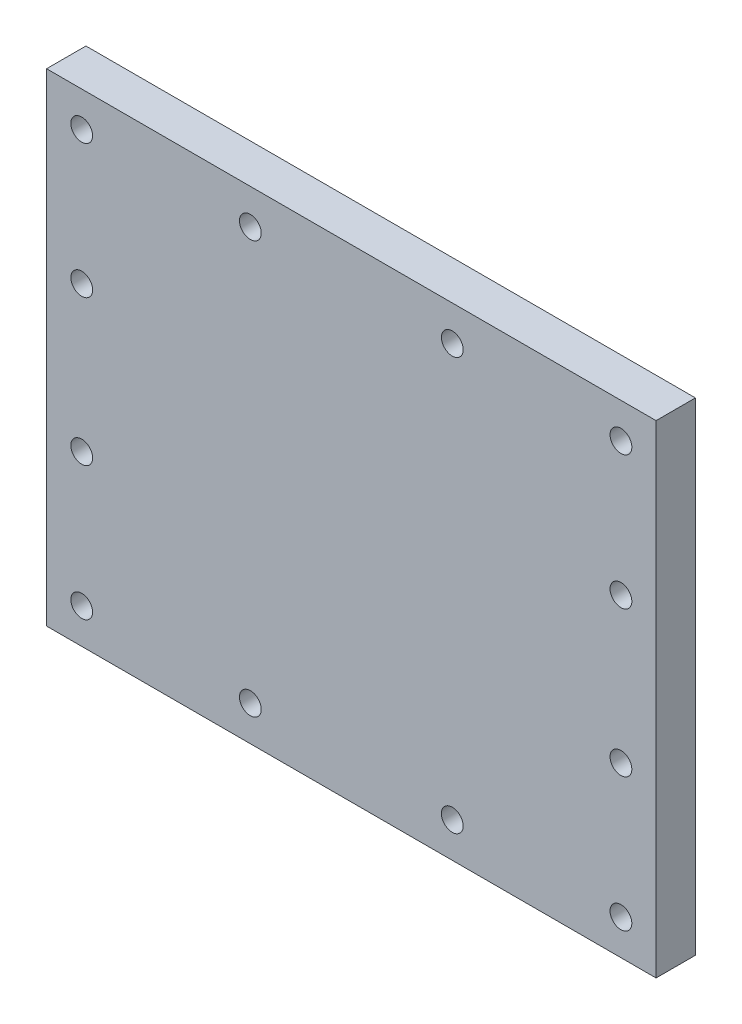
ISO-10303-21;
HEADER;
FILE_DESCRIPTION(('STEP AP214'),'2;1');
FILE_NAME('part.step','',(''),(''),'','','');
FILE_SCHEMA(('AUTOMOTIVE_DESIGN { 1 0 10303 214 1 1 1 1 }'));
ENDSEC;
DATA;
#1=APPLICATION_CONTEXT('core data for automotive mechanical design processes');
#2=APPLICATION_PROTOCOL_DEFINITION('international standard','automotive_design',2000,#1);
#3=PRODUCT_CONTEXT('',#1,'mechanical');
#4=PRODUCT('Part','Part','',(#3));
#5=PRODUCT_RELATED_PRODUCT_CATEGORY('part','',(#4));
#6=PRODUCT_DEFINITION_FORMATION('','',#4);
#7=PRODUCT_DEFINITION_CONTEXT('part definition',#1,'design');
#8=PRODUCT_DEFINITION('design','',#6,#7);
#9=PRODUCT_DEFINITION_SHAPE('','',#8);
#10=(LENGTH_UNIT() NAMED_UNIT(*) SI_UNIT(.MILLI.,.METRE.));
#11=(NAMED_UNIT(*) PLANE_ANGLE_UNIT() SI_UNIT($,.RADIAN.));
#12=(NAMED_UNIT(*) SI_UNIT($,.STERADIAN.) SOLID_ANGLE_UNIT());
#13=UNCERTAINTY_MEASURE_WITH_UNIT(LENGTH_MEASURE(1.E-05),#10,'distance_accuracy_value','');
#14=(GEOMETRIC_REPRESENTATION_CONTEXT(3) GLOBAL_UNCERTAINTY_ASSIGNED_CONTEXT((#13)) GLOBAL_UNIT_ASSIGNED_CONTEXT((#10,
#11,#12)) REPRESENTATION_CONTEXT('',''));
#15=CARTESIAN_POINT('',(0.,0.,0.));
#16=DIRECTION('',(0.,0.,1.));
#17=DIRECTION('',(1.,0.,0.));
#18=AXIS2_PLACEMENT_3D('',#15,#16,#17);
#19=CARTESIAN_POINT('',(-58.5243128246472,36.6443544247679,-5.51040500289528));
#20=DIRECTION('',(1.,0.,0.));
#21=DIRECTION('',(0.,1.,0.));
#22=AXIS2_PLACEMENT_3D('',#19,#20,#21);
#23=PLANE('',#22);
#24=DIRECTION('',(0.,-1.,0.));
#25=VECTOR('',#24,1.);
#26=CARTESIAN_POINT('',(-58.5243128246472,36.6443544247679,-11.1104050028953));
#27=LINE('',#26,#25);
#28=CARTESIAN_POINT('',(-58.5243128246472,105.341954424767,-11.1104050028953));
#29=VERTEX_POINT('',#28);
#30=CARTESIAN_POINT('',(-58.5243128246472,36.6443544247679,-11.1104050028953));
#31=VERTEX_POINT('',#30);
#32=EDGE_CURVE('E100',#29,#31,#27,.T.);
#33=ORIENTED_EDGE('',*,*,#32,.F.);
#34=DIRECTION('',(0.,0.,-1.));
#35=VECTOR('',#34,1.);
#36=CARTESIAN_POINT('',(-58.5243128246472,105.341954424767,-5.51040500289528));
#37=LINE('',#36,#35);
#38=CARTESIAN_POINT('',(-58.5243128246472,105.341954424767,-5.51040500289528));
#39=VERTEX_POINT('',#38);
#40=EDGE_CURVE('E11',#39,#29,#37,.T.);
#41=ORIENTED_EDGE('',*,*,#40,.F.);
#42=DIRECTION('',(0.,-1.,0.));
#43=VECTOR('',#42,1.);
#44=CARTESIAN_POINT('',(-58.5243128246472,36.6443544247679,-5.51040500289528));
#45=LINE('',#44,#43);
#46=CARTESIAN_POINT('',(-58.5243128246472,36.6443544247679,-5.51040500289528));
#47=VERTEX_POINT('',#46);
#48=EDGE_CURVE('E93',#39,#47,#45,.T.);
#49=ORIENTED_EDGE('',*,*,#48,.T.);
#50=DIRECTION('',(0.,0.,-1.));
#51=VECTOR('',#50,1.);
#52=CARTESIAN_POINT('',(-58.5243128246472,36.6443544247679,-5.51040500289528));
#53=LINE('',#52,#51);
#54=EDGE_CURVE('E38',#47,#31,#53,.T.);
#55=ORIENTED_EDGE('',*,*,#54,.T.);
#56=EDGE_LOOP('',(#33,#41,#49,#55));
#57=FACE_BOUND('',#56,.T.);
#58=ADVANCED_FACE('F35',(#57),#23,.T.);
#59=CARTESIAN_POINT('',(-58.5243128246472,105.341954424767,-5.51040500289528));
#60=DIRECTION('',(0.,1.,0.));
#61=DIRECTION('',(-1.,0.,0.));
#62=AXIS2_PLACEMENT_3D('',#59,#60,#61);
#63=PLANE('',#62);
#64=DIRECTION('',(1.,0.,0.));
#65=VECTOR('',#64,1.);
#66=CARTESIAN_POINT('',(-58.5243128246472,105.341954424767,-11.1104050028953));
#67=LINE('',#66,#65);
#68=CARTESIAN_POINT('',(-145.264312824647,105.341954424767,-11.1104050028953));
#69=VERTEX_POINT('',#68);
#70=EDGE_CURVE('E95',#69,#29,#67,.T.);
#71=ORIENTED_EDGE('',*,*,#70,.F.);
#72=DIRECTION('',(0.,0.,-1.));
#73=VECTOR('',#72,1.);
#74=CARTESIAN_POINT('',(-145.264312824647,105.341954424767,-5.51040500289528));
#75=LINE('',#74,#73);
#76=CARTESIAN_POINT('',(-145.264312824647,105.341954424767,-5.51040500289528));
#77=VERTEX_POINT('',#76);
#78=EDGE_CURVE('E44',#77,#69,#75,.T.);
#79=ORIENTED_EDGE('',*,*,#78,.F.);
#80=DIRECTION('',(1.,0.,0.));
#81=VECTOR('',#80,1.);
#82=CARTESIAN_POINT('',(-58.5243128246472,105.341954424767,-5.51040500289528));
#83=LINE('',#82,#81);
#84=EDGE_CURVE('E90',#77,#39,#83,.T.);
#85=ORIENTED_EDGE('',*,*,#84,.T.);
#86=ORIENTED_EDGE('',*,*,#40,.T.);
#87=EDGE_LOOP('',(#71,#79,#85,#86));
#88=FACE_BOUND('',#87,.T.);
#89=ADVANCED_FACE('F111',(#88),#63,.T.);
#90=CARTESIAN_POINT('',(-145.264312824647,36.6443544247679,-5.51040500289528));
#91=DIRECTION('',(-1.,0.,0.));
#92=DIRECTION('',(0.,0.,1.));
#93=AXIS2_PLACEMENT_3D('',#90,#91,#92);
#94=PLANE('',#93);
#95=DIRECTION('',(0.,1.,0.));
#96=VECTOR('',#95,1.);
#97=CARTESIAN_POINT('',(-145.264312824647,36.6443544247679,-11.1104050028953));
#98=LINE('',#97,#96);
#99=CARTESIAN_POINT('',(-145.264312824647,36.6443544247679,-11.1104050028953));
#100=VERTEX_POINT('',#99);
#101=EDGE_CURVE('E85',#100,#69,#98,.T.);
#102=ORIENTED_EDGE('',*,*,#101,.F.);
#103=DIRECTION('',(0.,0.,-1.));
#104=VECTOR('',#103,1.);
#105=CARTESIAN_POINT('',(-145.264312824647,36.6443544247679,-5.51040500289528));
#106=LINE('',#105,#104);
#107=CARTESIAN_POINT('',(-145.264312824647,36.6443544247679,-5.51040500289528));
#108=VERTEX_POINT('',#107);
#109=EDGE_CURVE('E80',#108,#100,#106,.T.);
#110=ORIENTED_EDGE('',*,*,#109,.F.);
#111=DIRECTION('',(0.,1.,0.));
#112=VECTOR('',#111,1.);
#113=CARTESIAN_POINT('',(-145.264312824647,36.6443544247679,-5.51040500289528));
#114=LINE('',#113,#112);
#115=EDGE_CURVE('E83',#108,#77,#114,.T.);
#116=ORIENTED_EDGE('',*,*,#115,.T.);
#117=ORIENTED_EDGE('',*,*,#78,.T.);
#118=EDGE_LOOP('',(#102,#110,#116,#117));
#119=FACE_BOUND('',#118,.T.);
#120=ADVANCED_FACE('F82',(#119),#94,.T.);
#121=CARTESIAN_POINT('',(-58.5243128246472,36.6443544247679,-5.51040500289528));
#122=DIRECTION('',(0.,-1.,0.));
#123=DIRECTION('',(1.,0.,0.));
#124=AXIS2_PLACEMENT_3D('',#121,#122,#123);
#125=PLANE('',#124);
#126=DIRECTION('',(-1.,0.,0.));
#127=VECTOR('',#126,1.);
#128=CARTESIAN_POINT('',(-58.5243128246472,36.6443544247679,-11.1104050028953));
#129=LINE('',#128,#127);
#130=EDGE_CURVE('E103',#31,#100,#129,.T.);
#131=ORIENTED_EDGE('',*,*,#130,.F.);
#132=ORIENTED_EDGE('',*,*,#54,.F.);
#133=DIRECTION('',(-1.,0.,0.));
#134=VECTOR('',#133,1.);
#135=CARTESIAN_POINT('',(-58.5243128246472,36.6443544247679,-5.51040500289528));
#136=LINE('',#135,#134);
#137=EDGE_CURVE('E89',#47,#108,#136,.T.);
#138=ORIENTED_EDGE('',*,*,#137,.T.);
#139=ORIENTED_EDGE('',*,*,#109,.T.);
#140=EDGE_LOOP('',(#131,#132,#138,#139));
#141=FACE_BOUND('',#140,.T.);
#142=ADVANCED_FACE('F92',(#141),#125,.T.);
#143=CARTESIAN_POINT('',(0.,0.,-5.51040500289528));
#144=DIRECTION('',(0.,0.,1.));
#145=DIRECTION('',(1.,0.,0.));
#146=AXIS2_PLACEMENT_3D('',#143,#144,#145);
#147=PLANE('',#146);
#148=CARTESIAN_POINT('',(-63.5243128246471,60.6443544247679,-5.51040500289528));
#149=DIRECTION('',(0.,0.,-1.));
#150=DIRECTION('',(-1.,0.,0.));
#151=AXIS2_PLACEMENT_3D('',#148,#149,#150);
#152=CIRCLE('',#151,1.54999999999999);
#153=CARTESIAN_POINT('',(-65.0743128246471,60.6443544247679,-5.51040500289528));
#154=VERTEX_POINT('',#153);
#155=EDGE_CURVE('E184',#154,#154,#152,.T.);
#156=ORIENTED_EDGE('',*,*,#155,.T.);
#157=EDGE_LOOP('',(#156));
#158=FACE_BOUND('',#157,.T.);
#159=CARTESIAN_POINT('',(-87.5243128246472,41.6443544247679,-5.51040500289528));
#160=DIRECTION('',(0.,0.,-1.));
#161=DIRECTION('',(-1.,0.,0.));
#162=AXIS2_PLACEMENT_3D('',#159,#160,#161);
#163=CIRCLE('',#162,1.54999999999999);
#164=CARTESIAN_POINT('',(-89.0743128246472,41.6443544247679,-5.51040500289528));
#165=VERTEX_POINT('',#164);
#166=EDGE_CURVE('E192',#165,#165,#163,.T.);
#167=ORIENTED_EDGE('',*,*,#166,.T.);
#168=EDGE_LOOP('',(#167));
#169=FACE_BOUND('',#168,.T.);
#170=CARTESIAN_POINT('',(-63.5243128246472,41.6443544247679,-5.51040500289528));
#171=DIRECTION('',(0.,0.,-1.));
#172=DIRECTION('',(-1.,0.,0.));
#173=AXIS2_PLACEMENT_3D('',#170,#171,#172);
#174=CIRCLE('',#173,1.54999999999999);
#175=CARTESIAN_POINT('',(-65.0743128246472,41.6443544247679,-5.51040500289528));
#176=VERTEX_POINT('',#175);
#177=EDGE_CURVE('E198',#176,#176,#174,.T.);
#178=ORIENTED_EDGE('',*,*,#177,.T.);
#179=EDGE_LOOP('',(#178));
#180=FACE_BOUND('',#179,.T.);
#181=CARTESIAN_POINT('',(-140.264312824647,81.3419544247674,-5.51040500289528));
#182=DIRECTION('',(0.,0.,-1.));
#183=DIRECTION('',(-1.,0.,0.));
#184=AXIS2_PLACEMENT_3D('',#181,#182,#183);
#185=CIRCLE('',#184,1.54999999999999);
#186=CARTESIAN_POINT('',(-141.814312824647,81.3419544247674,-5.51040500289528));
#187=VERTEX_POINT('',#186);
#188=EDGE_CURVE('E204',#187,#187,#185,.T.);
#189=ORIENTED_EDGE('',*,*,#188,.T.);
#190=EDGE_LOOP('',(#189));
#191=FACE_BOUND('',#190,.T.);
#192=CARTESIAN_POINT('',(-116.264312824647,100.341954424767,-5.51040500289528));
#193=DIRECTION('',(0.,0.,-1.));
#194=DIRECTION('',(-1.,0.,0.));
#195=AXIS2_PLACEMENT_3D('',#192,#193,#194);
#196=CIRCLE('',#195,1.54999999999999);
#197=CARTESIAN_POINT('',(-117.814312824647,100.341954424767,-5.51040500289528));
#198=VERTEX_POINT('',#197);
#199=EDGE_CURVE('E210',#198,#198,#196,.T.);
#200=ORIENTED_EDGE('',*,*,#199,.T.);
#201=EDGE_LOOP('',(#200));
#202=FACE_BOUND('',#201,.T.);
#203=CARTESIAN_POINT('',(-140.264312824647,100.341954424767,-5.51040500289528));
#204=DIRECTION('',(0.,0.,-1.));
#205=DIRECTION('',(-1.,0.,0.));
#206=AXIS2_PLACEMENT_3D('',#203,#204,#205);
#207=CIRCLE('',#206,1.54999999999999);
#208=CARTESIAN_POINT('',(-141.814312824647,100.341954424767,-5.51040500289528));
#209=VERTEX_POINT('',#208);
#210=EDGE_CURVE('E216',#209,#209,#207,.T.);
#211=ORIENTED_EDGE('',*,*,#210,.T.);
#212=EDGE_LOOP('',(#211));
#213=FACE_BOUND('',#212,.T.);
#214=CARTESIAN_POINT('',(-140.264312824647,41.6443544247679,-5.51040500289528));
#215=DIRECTION('',(0.,0.,-1.));
#216=DIRECTION('',(1.,0.,0.));
#217=AXIS2_PLACEMENT_3D('',#214,#215,#216);
#218=CIRCLE('',#217,1.54999999999999);
#219=CARTESIAN_POINT('',(-138.714312824647,41.6443544247679,-5.51040500289528));
#220=VERTEX_POINT('',#219);
#221=EDGE_CURVE('E222',#220,#220,#218,.T.);
#222=ORIENTED_EDGE('',*,*,#221,.T.);
#223=EDGE_LOOP('',(#222));
#224=FACE_BOUND('',#223,.T.);
#225=CARTESIAN_POINT('',(-116.264312824647,41.6443544247679,-5.51040500289528));
#226=DIRECTION('',(0.,0.,-1.));
#227=DIRECTION('',(1.,0.,0.));
#228=AXIS2_PLACEMENT_3D('',#225,#226,#227);
#229=CIRCLE('',#228,1.54999999999999);
#230=CARTESIAN_POINT('',(-114.714312824647,41.6443544247679,-5.51040500289528));
#231=VERTEX_POINT('',#230);
#232=EDGE_CURVE('E228',#231,#231,#229,.T.);
#233=ORIENTED_EDGE('',*,*,#232,.T.);
#234=EDGE_LOOP('',(#233));
#235=FACE_BOUND('',#234,.T.);
#236=CARTESIAN_POINT('',(-140.264312824647,60.6443544247679,-5.51040500289528));
#237=DIRECTION('',(0.,0.,-1.));
#238=DIRECTION('',(1.,0.,0.));
#239=AXIS2_PLACEMENT_3D('',#236,#237,#238);
#240=CIRCLE('',#239,1.54999999999999);
#241=CARTESIAN_POINT('',(-138.714312824647,60.6443544247679,-5.51040500289528));
#242=VERTEX_POINT('',#241);
#243=EDGE_CURVE('E234',#242,#242,#240,.T.);
#244=ORIENTED_EDGE('',*,*,#243,.T.);
#245=EDGE_LOOP('',(#244));
#246=FACE_BOUND('',#245,.T.);
#247=CARTESIAN_POINT('',(-63.5243128246472,100.341954424767,-5.51040500289528));
#248=DIRECTION('',(0.,0.,-1.));
#249=DIRECTION('',(1.,0.,0.));
#250=AXIS2_PLACEMENT_3D('',#247,#248,#249);
#251=CIRCLE('',#250,1.54999999999999);
#252=CARTESIAN_POINT('',(-61.9743128246472,100.341954424767,-5.51040500289528));
#253=VERTEX_POINT('',#252);
#254=EDGE_CURVE('E240',#253,#253,#251,.T.);
#255=ORIENTED_EDGE('',*,*,#254,.T.);
#256=EDGE_LOOP('',(#255));
#257=FACE_BOUND('',#256,.T.);
#258=CARTESIAN_POINT('',(-87.5243128246472,100.341954424767,-5.51040500289528));
#259=DIRECTION('',(0.,0.,-1.));
#260=DIRECTION('',(1.,0.,0.));
#261=AXIS2_PLACEMENT_3D('',#258,#259,#260);
#262=CIRCLE('',#261,1.54999999999999);
#263=CARTESIAN_POINT('',(-85.9743128246472,100.341954424767,-5.51040500289528));
#264=VERTEX_POINT('',#263);
#265=EDGE_CURVE('E246',#264,#264,#262,.T.);
#266=ORIENTED_EDGE('',*,*,#265,.T.);
#267=EDGE_LOOP('',(#266));
#268=FACE_BOUND('',#267,.T.);
#269=CARTESIAN_POINT('',(-63.5243128246471,81.3419544247674,-5.51040500289528));
#270=DIRECTION('',(0.,0.,-1.));
#271=DIRECTION('',(1.,0.,0.));
#272=AXIS2_PLACEMENT_3D('',#269,#270,#271);
#273=CIRCLE('',#272,1.54999999999999);
#274=CARTESIAN_POINT('',(-61.9743128246471,81.3419544247674,-5.51040500289528));
#275=VERTEX_POINT('',#274);
#276=EDGE_CURVE('E104',#275,#275,#273,.T.);
#277=ORIENTED_EDGE('',*,*,#276,.T.);
#278=EDGE_LOOP('',(#277));
#279=FACE_BOUND('',#278,.T.);
#280=ORIENTED_EDGE('',*,*,#48,.F.);
#281=ORIENTED_EDGE('',*,*,#84,.F.);
#282=ORIENTED_EDGE('',*,*,#115,.F.);
#283=ORIENTED_EDGE('',*,*,#137,.F.);
#284=EDGE_LOOP('',(#280,#281,#282,#283));
#285=FACE_BOUND('',#284,.T.);
#286=ADVANCED_FACE('F88',(#158,#169,#180,#191,#202,#213,#224,#235,#246,#257,#268,#279,#285),
#147,.T.);
#287=CARTESIAN_POINT('',(0.,0.,-11.1104050028953));
#288=DIRECTION('',(0.,0.,1.));
#289=DIRECTION('',(1.,0.,0.));
#290=AXIS2_PLACEMENT_3D('',#287,#288,#289);
#291=PLANE('',#290);
#292=CARTESIAN_POINT('',(-63.5243128246471,60.6443544247679,-11.1104050028953));
#293=DIRECTION('',(0.,0.,-1.));
#294=DIRECTION('',(-1.,0.,0.));
#295=AXIS2_PLACEMENT_3D('',#292,#293,#294);
#296=CIRCLE('',#295,1.54999999999999);
#297=CARTESIAN_POINT('',(-65.0743128246471,60.6443544247679,-11.1104050028953));
#298=VERTEX_POINT('',#297);
#299=EDGE_CURVE('E187',#298,#298,#296,.T.);
#300=ORIENTED_EDGE('',*,*,#299,.F.);
#301=EDGE_LOOP('',(#300));
#302=FACE_BOUND('',#301,.T.);
#303=CARTESIAN_POINT('',(-87.5243128246472,41.6443544247679,-11.1104050028953));
#304=DIRECTION('',(0.,0.,-1.));
#305=DIRECTION('',(-1.,0.,0.));
#306=AXIS2_PLACEMENT_3D('',#303,#304,#305);
#307=CIRCLE('',#306,1.54999999999999);
#308=CARTESIAN_POINT('',(-89.0743128246472,41.6443544247679,-11.1104050028953));
#309=VERTEX_POINT('',#308);
#310=EDGE_CURVE('E189',#309,#309,#307,.T.);
#311=ORIENTED_EDGE('',*,*,#310,.F.);
#312=EDGE_LOOP('',(#311));
#313=FACE_BOUND('',#312,.T.);
#314=CARTESIAN_POINT('',(-63.5243128246472,41.6443544247679,-11.1104050028953));
#315=DIRECTION('',(0.,0.,-1.));
#316=DIRECTION('',(-1.,0.,0.));
#317=AXIS2_PLACEMENT_3D('',#314,#315,#316);
#318=CIRCLE('',#317,1.54999999999999);
#319=CARTESIAN_POINT('',(-65.0743128246472,41.6443544247679,-11.1104050028953));
#320=VERTEX_POINT('',#319);
#321=EDGE_CURVE('E195',#320,#320,#318,.T.);
#322=ORIENTED_EDGE('',*,*,#321,.F.);
#323=EDGE_LOOP('',(#322));
#324=FACE_BOUND('',#323,.T.);
#325=CARTESIAN_POINT('',(-140.264312824647,81.3419544247674,-11.1104050028953));
#326=DIRECTION('',(0.,0.,-1.));
#327=DIRECTION('',(-1.,0.,0.));
#328=AXIS2_PLACEMENT_3D('',#325,#326,#327);
#329=CIRCLE('',#328,1.54999999999999);
#330=CARTESIAN_POINT('',(-141.814312824647,81.3419544247674,-11.1104050028953));
#331=VERTEX_POINT('',#330);
#332=EDGE_CURVE('E201',#331,#331,#329,.T.);
#333=ORIENTED_EDGE('',*,*,#332,.F.);
#334=EDGE_LOOP('',(#333));
#335=FACE_BOUND('',#334,.T.);
#336=CARTESIAN_POINT('',(-116.264312824647,100.341954424767,-11.1104050028953));
#337=DIRECTION('',(0.,0.,-1.));
#338=DIRECTION('',(-1.,0.,0.));
#339=AXIS2_PLACEMENT_3D('',#336,#337,#338);
#340=CIRCLE('',#339,1.54999999999999);
#341=CARTESIAN_POINT('',(-117.814312824647,100.341954424767,-11.1104050028953));
#342=VERTEX_POINT('',#341);
#343=EDGE_CURVE('E207',#342,#342,#340,.T.);
#344=ORIENTED_EDGE('',*,*,#343,.F.);
#345=EDGE_LOOP('',(#344));
#346=FACE_BOUND('',#345,.T.);
#347=CARTESIAN_POINT('',(-140.264312824647,100.341954424767,-11.1104050028953));
#348=DIRECTION('',(0.,0.,-1.));
#349=DIRECTION('',(-1.,0.,0.));
#350=AXIS2_PLACEMENT_3D('',#347,#348,#349);
#351=CIRCLE('',#350,1.54999999999999);
#352=CARTESIAN_POINT('',(-141.814312824647,100.341954424767,-11.1104050028953));
#353=VERTEX_POINT('',#352);
#354=EDGE_CURVE('E213',#353,#353,#351,.T.);
#355=ORIENTED_EDGE('',*,*,#354,.F.);
#356=EDGE_LOOP('',(#355));
#357=FACE_BOUND('',#356,.T.);
#358=CARTESIAN_POINT('',(-140.264312824647,41.6443544247679,-11.1104050028953));
#359=DIRECTION('',(0.,0.,-1.));
#360=DIRECTION('',(1.,0.,0.));
#361=AXIS2_PLACEMENT_3D('',#358,#359,#360);
#362=CIRCLE('',#361,1.54999999999999);
#363=CARTESIAN_POINT('',(-138.714312824647,41.6443544247679,-11.1104050028953));
#364=VERTEX_POINT('',#363);
#365=EDGE_CURVE('E219',#364,#364,#362,.T.);
#366=ORIENTED_EDGE('',*,*,#365,.F.);
#367=EDGE_LOOP('',(#366));
#368=FACE_BOUND('',#367,.T.);
#369=CARTESIAN_POINT('',(-116.264312824647,41.6443544247679,-11.1104050028953));
#370=DIRECTION('',(0.,0.,-1.));
#371=DIRECTION('',(1.,0.,0.));
#372=AXIS2_PLACEMENT_3D('',#369,#370,#371);
#373=CIRCLE('',#372,1.54999999999999);
#374=CARTESIAN_POINT('',(-114.714312824647,41.6443544247679,-11.1104050028953));
#375=VERTEX_POINT('',#374);
#376=EDGE_CURVE('E225',#375,#375,#373,.T.);
#377=ORIENTED_EDGE('',*,*,#376,.F.);
#378=EDGE_LOOP('',(#377));
#379=FACE_BOUND('',#378,.T.);
#380=CARTESIAN_POINT('',(-140.264312824647,60.6443544247679,-11.1104050028953));
#381=DIRECTION('',(0.,0.,-1.));
#382=DIRECTION('',(1.,0.,0.));
#383=AXIS2_PLACEMENT_3D('',#380,#381,#382);
#384=CIRCLE('',#383,1.54999999999999);
#385=CARTESIAN_POINT('',(-138.714312824647,60.6443544247679,-11.1104050028953));
#386=VERTEX_POINT('',#385);
#387=EDGE_CURVE('E231',#386,#386,#384,.T.);
#388=ORIENTED_EDGE('',*,*,#387,.F.);
#389=EDGE_LOOP('',(#388));
#390=FACE_BOUND('',#389,.T.);
#391=CARTESIAN_POINT('',(-63.5243128246472,100.341954424767,-11.1104050028953));
#392=DIRECTION('',(0.,0.,-1.));
#393=DIRECTION('',(1.,0.,0.));
#394=AXIS2_PLACEMENT_3D('',#391,#392,#393);
#395=CIRCLE('',#394,1.54999999999999);
#396=CARTESIAN_POINT('',(-61.9743128246472,100.341954424767,-11.1104050028953));
#397=VERTEX_POINT('',#396);
#398=EDGE_CURVE('E237',#397,#397,#395,.T.);
#399=ORIENTED_EDGE('',*,*,#398,.F.);
#400=EDGE_LOOP('',(#399));
#401=FACE_BOUND('',#400,.T.);
#402=CARTESIAN_POINT('',(-87.5243128246472,100.341954424767,-11.1104050028953));
#403=DIRECTION('',(0.,0.,-1.));
#404=DIRECTION('',(1.,0.,0.));
#405=AXIS2_PLACEMENT_3D('',#402,#403,#404);
#406=CIRCLE('',#405,1.54999999999999);
#407=CARTESIAN_POINT('',(-85.9743128246472,100.341954424767,-11.1104050028953));
#408=VERTEX_POINT('',#407);
#409=EDGE_CURVE('E243',#408,#408,#406,.T.);
#410=ORIENTED_EDGE('',*,*,#409,.F.);
#411=EDGE_LOOP('',(#410));
#412=FACE_BOUND('',#411,.T.);
#413=CARTESIAN_POINT('',(-63.5243128246471,81.3419544247674,-11.1104050028953));
#414=DIRECTION('',(0.,0.,-1.));
#415=DIRECTION('',(1.,0.,0.));
#416=AXIS2_PLACEMENT_3D('',#413,#414,#415);
#417=CIRCLE('',#416,1.54999999999999);
#418=CARTESIAN_POINT('',(-61.9743128246471,81.3419544247674,-11.1104050028953));
#419=VERTEX_POINT('',#418);
#420=EDGE_CURVE('E249',#419,#419,#417,.T.);
#421=ORIENTED_EDGE('',*,*,#420,.F.);
#422=EDGE_LOOP('',(#421));
#423=FACE_BOUND('',#422,.T.);
#424=ORIENTED_EDGE('',*,*,#32,.T.);
#425=ORIENTED_EDGE('',*,*,#130,.T.);
#426=ORIENTED_EDGE('',*,*,#101,.T.);
#427=ORIENTED_EDGE('',*,*,#70,.T.);
#428=EDGE_LOOP('',(#424,#425,#426,#427));
#429=FACE_BOUND('',#428,.T.);
#430=ADVANCED_FACE('F110',(#302,#313,#324,#335,#346,#357,#368,#379,#390,#401,#412,#423,#429),
#291,.F.);
#431=CARTESIAN_POINT('',(-63.5243128246471,81.3419544247674,-5.51040500289528));
#432=DIRECTION('',(0.,0.,-1.));
#433=DIRECTION('',(-1.,0.,0.));
#434=AXIS2_PLACEMENT_3D('',#431,#432,#433);
#435=CYLINDRICAL_SURFACE('',#434,1.54999999999999);
#436=ORIENTED_EDGE('',*,*,#276,.F.);
#437=EDGE_LOOP('',(#436));
#438=FACE_BOUND('',#437,.T.);
#439=ORIENTED_EDGE('',*,*,#420,.T.);
#440=EDGE_LOOP('',(#439));
#441=FACE_BOUND('',#440,.T.);
#442=ADVANCED_FACE('F129',(#438,#441),#435,.F.);
#443=CARTESIAN_POINT('',(-87.5243128246472,100.341954424767,-5.51040500289528));
#444=DIRECTION('',(0.,0.,-1.));
#445=DIRECTION('',(-1.,0.,0.));
#446=AXIS2_PLACEMENT_3D('',#443,#444,#445);
#447=CYLINDRICAL_SURFACE('',#446,1.54999999999999);
#448=ORIENTED_EDGE('',*,*,#265,.F.);
#449=EDGE_LOOP('',(#448));
#450=FACE_BOUND('',#449,.T.);
#451=ORIENTED_EDGE('',*,*,#409,.T.);
#452=EDGE_LOOP('',(#451));
#453=FACE_BOUND('',#452,.T.);
#454=ADVANCED_FACE('F136',(#450,#453),#447,.F.);
#455=CARTESIAN_POINT('',(-63.5243128246472,100.341954424767,-5.51040500289528));
#456=DIRECTION('',(0.,0.,-1.));
#457=DIRECTION('',(-1.,0.,0.));
#458=AXIS2_PLACEMENT_3D('',#455,#456,#457);
#459=CYLINDRICAL_SURFACE('',#458,1.54999999999999);
#460=ORIENTED_EDGE('',*,*,#254,.F.);
#461=EDGE_LOOP('',(#460));
#462=FACE_BOUND('',#461,.T.);
#463=ORIENTED_EDGE('',*,*,#398,.T.);
#464=EDGE_LOOP('',(#463));
#465=FACE_BOUND('',#464,.T.);
#466=ADVANCED_FACE('F140',(#462,#465),#459,.F.);
#467=CARTESIAN_POINT('',(-140.264312824647,60.6443544247679,-5.51040500289528));
#468=DIRECTION('',(0.,0.,-1.));
#469=DIRECTION('',(-1.,0.,0.));
#470=AXIS2_PLACEMENT_3D('',#467,#468,#469);
#471=CYLINDRICAL_SURFACE('',#470,1.54999999999999);
#472=ORIENTED_EDGE('',*,*,#243,.F.);
#473=EDGE_LOOP('',(#472));
#474=FACE_BOUND('',#473,.T.);
#475=ORIENTED_EDGE('',*,*,#387,.T.);
#476=EDGE_LOOP('',(#475));
#477=FACE_BOUND('',#476,.T.);
#478=ADVANCED_FACE('F144',(#474,#477),#471,.F.);
#479=CARTESIAN_POINT('',(-116.264312824647,41.6443544247679,-5.51040500289528));
#480=DIRECTION('',(0.,0.,-1.));
#481=DIRECTION('',(-1.,0.,0.));
#482=AXIS2_PLACEMENT_3D('',#479,#480,#481);
#483=CYLINDRICAL_SURFACE('',#482,1.54999999999999);
#484=ORIENTED_EDGE('',*,*,#232,.F.);
#485=EDGE_LOOP('',(#484));
#486=FACE_BOUND('',#485,.T.);
#487=ORIENTED_EDGE('',*,*,#376,.T.);
#488=EDGE_LOOP('',(#487));
#489=FACE_BOUND('',#488,.T.);
#490=ADVANCED_FACE('F148',(#486,#489),#483,.F.);
#491=CARTESIAN_POINT('',(-140.264312824647,41.6443544247679,-5.51040500289528));
#492=DIRECTION('',(0.,0.,-1.));
#493=DIRECTION('',(-1.,0.,0.));
#494=AXIS2_PLACEMENT_3D('',#491,#492,#493);
#495=CYLINDRICAL_SURFACE('',#494,1.54999999999999);
#496=ORIENTED_EDGE('',*,*,#221,.F.);
#497=EDGE_LOOP('',(#496));
#498=FACE_BOUND('',#497,.T.);
#499=ORIENTED_EDGE('',*,*,#365,.T.);
#500=EDGE_LOOP('',(#499));
#501=FACE_BOUND('',#500,.T.);
#502=ADVANCED_FACE('F152',(#498,#501),#495,.F.);
#503=CARTESIAN_POINT('',(-140.264312824647,100.341954424767,-5.51040500289528));
#504=DIRECTION('',(0.,0.,-1.));
#505=DIRECTION('',(-1.,0.,0.));
#506=AXIS2_PLACEMENT_3D('',#503,#504,#505);
#507=CYLINDRICAL_SURFACE('',#506,1.54999999999999);
#508=ORIENTED_EDGE('',*,*,#210,.F.);
#509=EDGE_LOOP('',(#508));
#510=FACE_BOUND('',#509,.T.);
#511=ORIENTED_EDGE('',*,*,#354,.T.);
#512=EDGE_LOOP('',(#511));
#513=FACE_BOUND('',#512,.T.);
#514=ADVANCED_FACE('F156',(#510,#513),#507,.F.);
#515=CARTESIAN_POINT('',(-116.264312824647,100.341954424767,-5.51040500289528));
#516=DIRECTION('',(0.,0.,-1.));
#517=DIRECTION('',(-1.,0.,0.));
#518=AXIS2_PLACEMENT_3D('',#515,#516,#517);
#519=CYLINDRICAL_SURFACE('',#518,1.54999999999999);
#520=ORIENTED_EDGE('',*,*,#199,.F.);
#521=EDGE_LOOP('',(#520));
#522=FACE_BOUND('',#521,.T.);
#523=ORIENTED_EDGE('',*,*,#343,.T.);
#524=EDGE_LOOP('',(#523));
#525=FACE_BOUND('',#524,.T.);
#526=ADVANCED_FACE('F160',(#522,#525),#519,.F.);
#527=CARTESIAN_POINT('',(-140.264312824647,81.3419544247674,-5.51040500289528));
#528=DIRECTION('',(0.,0.,-1.));
#529=DIRECTION('',(-1.,0.,0.));
#530=AXIS2_PLACEMENT_3D('',#527,#528,#529);
#531=CYLINDRICAL_SURFACE('',#530,1.54999999999999);
#532=ORIENTED_EDGE('',*,*,#188,.F.);
#533=EDGE_LOOP('',(#532));
#534=FACE_BOUND('',#533,.T.);
#535=ORIENTED_EDGE('',*,*,#332,.T.);
#536=EDGE_LOOP('',(#535));
#537=FACE_BOUND('',#536,.T.);
#538=ADVANCED_FACE('F164',(#534,#537),#531,.F.);
#539=CARTESIAN_POINT('',(-63.5243128246472,41.6443544247679,-5.51040500289528));
#540=DIRECTION('',(0.,0.,-1.));
#541=DIRECTION('',(-1.,0.,0.));
#542=AXIS2_PLACEMENT_3D('',#539,#540,#541);
#543=CYLINDRICAL_SURFACE('',#542,1.54999999999999);
#544=ORIENTED_EDGE('',*,*,#177,.F.);
#545=EDGE_LOOP('',(#544));
#546=FACE_BOUND('',#545,.T.);
#547=ORIENTED_EDGE('',*,*,#321,.T.);
#548=EDGE_LOOP('',(#547));
#549=FACE_BOUND('',#548,.T.);
#550=ADVANCED_FACE('F168',(#546,#549),#543,.F.);
#551=CARTESIAN_POINT('',(-87.5243128246472,41.6443544247679,-5.51040500289528));
#552=DIRECTION('',(0.,0.,-1.));
#553=DIRECTION('',(-1.,0.,0.));
#554=AXIS2_PLACEMENT_3D('',#551,#552,#553);
#555=CYLINDRICAL_SURFACE('',#554,1.54999999999999);
#556=ORIENTED_EDGE('',*,*,#166,.F.);
#557=EDGE_LOOP('',(#556));
#558=FACE_BOUND('',#557,.T.);
#559=ORIENTED_EDGE('',*,*,#310,.T.);
#560=EDGE_LOOP('',(#559));
#561=FACE_BOUND('',#560,.T.);
#562=ADVANCED_FACE('F172',(#558,#561),#555,.F.);
#563=CARTESIAN_POINT('',(-63.5243128246471,60.6443544247679,-5.51040500289528));
#564=DIRECTION('',(0.,0.,-1.));
#565=DIRECTION('',(-1.,0.,0.));
#566=AXIS2_PLACEMENT_3D('',#563,#564,#565);
#567=CYLINDRICAL_SURFACE('',#566,1.54999999999999);
#568=ORIENTED_EDGE('',*,*,#155,.F.);
#569=EDGE_LOOP('',(#568));
#570=FACE_BOUND('',#569,.T.);
#571=ORIENTED_EDGE('',*,*,#299,.T.);
#572=EDGE_LOOP('',(#571));
#573=FACE_BOUND('',#572,.T.);
#574=ADVANCED_FACE('F176',(#570,#573),#567,.F.);
#575=CLOSED_SHELL('',(#58,#89,#120,#142,#286,#430,#442,#454,#466,#478,#490,#502,#514,#526,#538,
#550,#562,#574));
#576=MANIFOLD_SOLID_BREP('B2',#575);
#577=ADVANCED_BREP_SHAPE_REPRESENTATION('',(#18,#576),#14);
#578=SHAPE_DEFINITION_REPRESENTATION(#9,#577);
ENDSEC;
END-ISO-10303-21;
